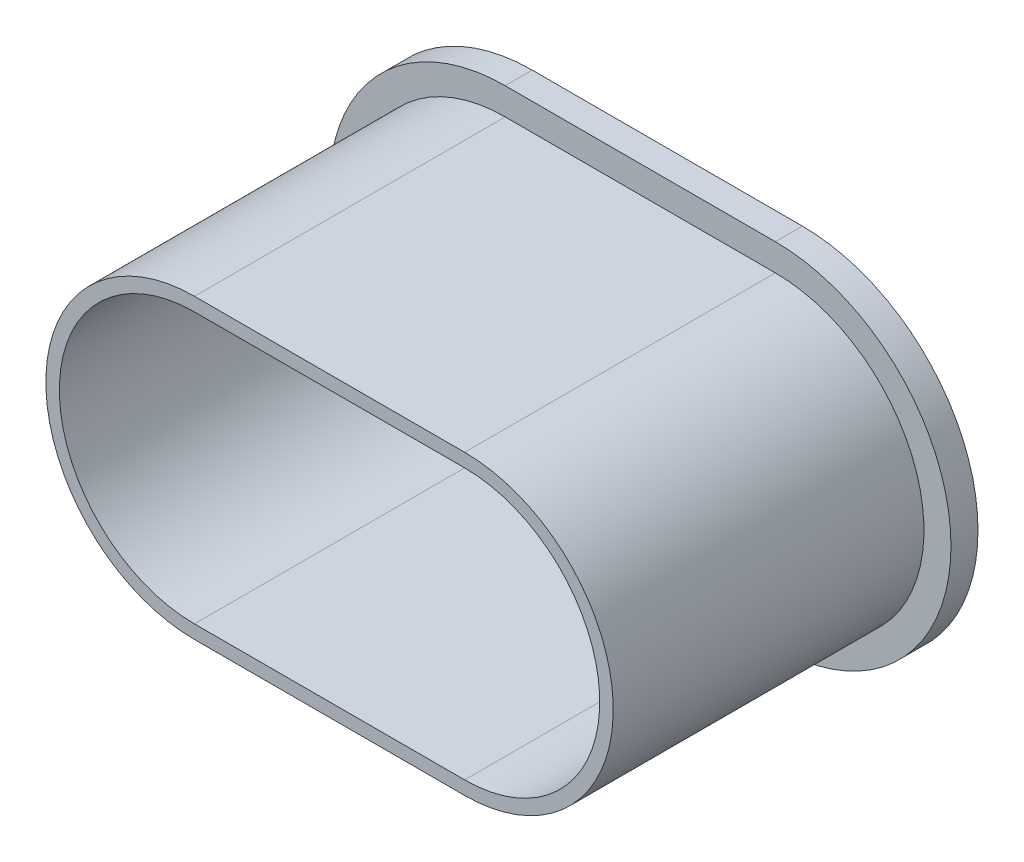
ISO-10303-21;
HEADER;
FILE_DESCRIPTION(('STEP AP214'),'2;1');
FILE_NAME('part.step','',(''),(''),'','','');
FILE_SCHEMA(('AUTOMOTIVE_DESIGN { 1 0 10303 214 1 1 1 1 }'));
ENDSEC;
DATA;
#1=APPLICATION_CONTEXT('core data for automotive mechanical design processes');
#2=APPLICATION_PROTOCOL_DEFINITION('international standard','automotive_design',2000,#1);
#3=PRODUCT_CONTEXT('',#1,'mechanical');
#4=PRODUCT('Part','Part','',(#3));
#5=PRODUCT_RELATED_PRODUCT_CATEGORY('part','',(#4));
#6=PRODUCT_DEFINITION_FORMATION('','',#4);
#7=PRODUCT_DEFINITION_CONTEXT('part definition',#1,'design');
#8=PRODUCT_DEFINITION('design','',#6,#7);
#9=PRODUCT_DEFINITION_SHAPE('','',#8);
#10=(LENGTH_UNIT() NAMED_UNIT(*) SI_UNIT(.MILLI.,.METRE.));
#11=(NAMED_UNIT(*) PLANE_ANGLE_UNIT() SI_UNIT($,.RADIAN.));
#12=(NAMED_UNIT(*) SI_UNIT($,.STERADIAN.) SOLID_ANGLE_UNIT());
#13=UNCERTAINTY_MEASURE_WITH_UNIT(LENGTH_MEASURE(1.E-05),#10,'distance_accuracy_value','');
#14=(GEOMETRIC_REPRESENTATION_CONTEXT(3) GLOBAL_UNCERTAINTY_ASSIGNED_CONTEXT((#13)) GLOBAL_UNIT_ASSIGNED_CONTEXT((#10,
#11,#12)) REPRESENTATION_CONTEXT('',''));
#15=CARTESIAN_POINT('',(0.,0.,0.));
#16=DIRECTION('',(0.,0.,1.));
#17=DIRECTION('',(1.,0.,0.));
#18=AXIS2_PLACEMENT_3D('',#15,#16,#17);
#19=CARTESIAN_POINT('',(-7.16804413634069,-3.46164349097961,2.));
#20=DIRECTION('',(0.,0.,-1.));
#21=DIRECTION('',(-1.,0.,0.));
#22=AXIS2_PLACEMENT_3D('',#19,#20,#21);
#23=PLANE('',#22);
#24=CARTESIAN_POINT('',(-7.16804413634069,-3.46164349097961,2.));
#25=DIRECTION('',(0.,0.,1.));
#26=DIRECTION('',(-1.,0.,0.));
#27=AXIS2_PLACEMENT_3D('',#24,#25,#26);
#28=CIRCLE('',#27,13.);
#29=CARTESIAN_POINT('',(-7.16804413634069,-16.4616434909796,2.));
#30=VERTEX_POINT('',#29);
#31=CARTESIAN_POINT('',(-7.16804413634069,9.53835650902039,2.));
#32=VERTEX_POINT('',#31);
#33=EDGE_CURVE('E193',#30,#32,#28,.T.);
#34=ORIENTED_EDGE('',*,*,#33,.T.);
#35=DIRECTION('',(-1.,0.,0.));
#36=VECTOR('',#35,1.);
#37=CARTESIAN_POINT('',(-27.1680441363407,9.53835650902039,2.));
#38=LINE('',#37,#36);
#39=CARTESIAN_POINT('',(-27.1680441363407,9.53835650902039,2.));
#40=VERTEX_POINT('',#39);
#41=EDGE_CURVE('E196',#32,#40,#38,.T.);
#42=ORIENTED_EDGE('',*,*,#41,.T.);
#43=CARTESIAN_POINT('',(-27.1680441363407,-3.46164349097961,2.));
#44=DIRECTION('',(0.,0.,1.));
#45=DIRECTION('',(-1.,0.,0.));
#46=AXIS2_PLACEMENT_3D('',#43,#44,#45);
#47=CIRCLE('',#46,13.);
#48=CARTESIAN_POINT('',(-27.1680441363407,-16.4616434909796,2.));
#49=VERTEX_POINT('',#48);
#50=EDGE_CURVE('E199',#40,#49,#47,.T.);
#51=ORIENTED_EDGE('',*,*,#50,.T.);
#52=DIRECTION('',(1.,0.,0.));
#53=VECTOR('',#52,1.);
#54=CARTESIAN_POINT('',(-7.16804413634069,-16.4616434909796,2.));
#55=LINE('',#54,#53);
#56=EDGE_CURVE('E201',#49,#30,#55,.T.);
#57=ORIENTED_EDGE('',*,*,#56,.T.);
#58=EDGE_LOOP('',(#34,#42,#51,#57));
#59=FACE_BOUND('',#58,.T.);
#60=CARTESIAN_POINT('',(-7.16804413634065,-3.46164349097961,2.));
#61=DIRECTION('',(0.,0.,1.));
#62=DIRECTION('',(-1.,0.,0.));
#63=AXIS2_PLACEMENT_3D('',#60,#61,#62);
#64=CIRCLE('',#63,11.);
#65=CARTESIAN_POINT('',(-7.16804413634058,-14.4616434909796,2.));
#66=VERTEX_POINT('',#65);
#67=CARTESIAN_POINT('',(-7.16804413634072,7.53835650902039,2.));
#68=VERTEX_POINT('',#67);
#69=EDGE_CURVE('E152',#66,#68,#64,.T.);
#70=ORIENTED_EDGE('',*,*,#69,.F.);
#71=DIRECTION('',(1.,0.,0.));
#72=VECTOR('',#71,1.);
#73=CARTESIAN_POINT('',(-27.1680441363407,-14.4616434909796,2.));
#74=LINE('',#73,#72);
#75=CARTESIAN_POINT('',(-27.1680441363407,-14.4616434909796,2.));
#76=VERTEX_POINT('',#75);
#77=EDGE_CURVE('E157',#76,#66,#74,.T.);
#78=ORIENTED_EDGE('',*,*,#77,.F.);
#79=CARTESIAN_POINT('',(-27.1680441363407,-3.46164349097961,2.));
#80=DIRECTION('',(0.,0.,1.));
#81=DIRECTION('',(-1.,0.,0.));
#82=AXIS2_PLACEMENT_3D('',#79,#80,#81);
#83=CIRCLE('',#82,11.);
#84=CARTESIAN_POINT('',(-27.1680441363407,7.53835650902039,2.));
#85=VERTEX_POINT('',#84);
#86=EDGE_CURVE('E53',#85,#76,#83,.T.);
#87=ORIENTED_EDGE('',*,*,#86,.F.);
#88=DIRECTION('',(-1.,0.,0.));
#89=VECTOR('',#88,1.);
#90=CARTESIAN_POINT('',(-27.1680441363407,7.53835650902039,2.));
#91=LINE('',#90,#89);
#92=EDGE_CURVE('E48',#68,#85,#91,.T.);
#93=ORIENTED_EDGE('',*,*,#92,.F.);
#94=EDGE_LOOP('',(#70,#78,#87,#93));
#95=FACE_BOUND('',#94,.T.);
#96=ADVANCED_FACE('F33',(#59,#95),#23,.F.);
#97=CARTESIAN_POINT('',(-7.16804413634069,-3.46164349097961,0.));
#98=DIRECTION('',(0.,0.,-1.));
#99=DIRECTION('',(-1.,0.,0.));
#100=AXIS2_PLACEMENT_3D('',#97,#98,#99);
#101=PLANE('',#100);
#102=CARTESIAN_POINT('',(-17.1680441363407,-14.4616434909796,0.));
#103=DIRECTION('',(0.,0.,-1.));
#104=DIRECTION('',(-1.,0.,0.));
#105=AXIS2_PLACEMENT_3D('',#102,#103,#104);
#106=CIRCLE('',#105,0.3);
#107=CARTESIAN_POINT('',(-17.4680441363407,-14.4616434909796,0.));
#108=VERTEX_POINT('',#107);
#109=EDGE_CURVE('E301',#108,#108,#106,.T.);
#110=ORIENTED_EDGE('',*,*,#109,.F.);
#111=EDGE_LOOP('',(#110));
#112=FACE_BOUND('',#111,.T.);
#113=CARTESIAN_POINT('',(-7.16804413634069,-3.46164349097961,0.));
#114=DIRECTION('',(0.,0.,1.));
#115=DIRECTION('',(-1.,0.,0.));
#116=AXIS2_PLACEMENT_3D('',#113,#114,#115);
#117=CIRCLE('',#116,13.);
#118=CARTESIAN_POINT('',(-7.16804413634069,-16.4616434909796,0.));
#119=VERTEX_POINT('',#118);
#120=CARTESIAN_POINT('',(-7.16804413634069,9.53835650902039,0.));
#121=VERTEX_POINT('',#120);
#122=EDGE_CURVE('E130',#119,#121,#117,.T.);
#123=ORIENTED_EDGE('',*,*,#122,.F.);
#124=DIRECTION('',(1.,0.,0.));
#125=VECTOR('',#124,1.);
#126=CARTESIAN_POINT('',(-7.16804413634069,-16.4616434909796,0.));
#127=LINE('',#126,#125);
#128=CARTESIAN_POINT('',(-27.1680441363407,-16.4616434909796,0.));
#129=VERTEX_POINT('',#128);
#130=EDGE_CURVE('E197',#129,#119,#127,.T.);
#131=ORIENTED_EDGE('',*,*,#130,.F.);
#132=CARTESIAN_POINT('',(-27.1680441363407,-3.46164349097961,0.));
#133=DIRECTION('',(0.,0.,1.));
#134=DIRECTION('',(-1.,0.,0.));
#135=AXIS2_PLACEMENT_3D('',#132,#133,#134);
#136=CIRCLE('',#135,13.);
#137=CARTESIAN_POINT('',(-27.1680441363407,9.53835650902039,0.));
#138=VERTEX_POINT('',#137);
#139=EDGE_CURVE('E208',#138,#129,#136,.T.);
#140=ORIENTED_EDGE('',*,*,#139,.F.);
#141=DIRECTION('',(-1.,0.,0.));
#142=VECTOR('',#141,1.);
#143=CARTESIAN_POINT('',(-27.1680441363407,9.53835650902039,0.));
#144=LINE('',#143,#142);
#145=EDGE_CURVE('E206',#121,#138,#144,.T.);
#146=ORIENTED_EDGE('',*,*,#145,.F.);
#147=EDGE_LOOP('',(#123,#131,#140,#146));
#148=FACE_BOUND('',#147,.T.);
#149=DIRECTION('',(-1.,0.,0.));
#150=VECTOR('',#149,1.);
#151=CARTESIAN_POINT('',(-27.1680441363407,6.53835650902039,0.));
#152=LINE('',#151,#150);
#153=CARTESIAN_POINT('',(-7.16804413634069,6.53835650902039,0.));
#154=VERTEX_POINT('',#153);
#155=CARTESIAN_POINT('',(-27.1680441363407,6.53835650902039,0.));
#156=VERTEX_POINT('',#155);
#157=EDGE_CURVE('E186',#154,#156,#152,.T.);
#158=ORIENTED_EDGE('',*,*,#157,.T.);
#159=CARTESIAN_POINT('',(-27.1680441363407,-3.46164349097961,0.));
#160=DIRECTION('',(0.,0.,1.));
#161=DIRECTION('',(-1.,0.,0.));
#162=AXIS2_PLACEMENT_3D('',#159,#160,#161);
#163=CIRCLE('',#162,10.);
#164=CARTESIAN_POINT('',(-27.1680441363407,-13.4616434909796,0.));
#165=VERTEX_POINT('',#164);
#166=EDGE_CURVE('E180',#156,#165,#163,.T.);
#167=ORIENTED_EDGE('',*,*,#166,.T.);
#168=DIRECTION('',(1.,0.,0.));
#169=VECTOR('',#168,1.);
#170=CARTESIAN_POINT('',(-27.1680441363407,-13.4616434909796,0.));
#171=LINE('',#170,#169);
#172=CARTESIAN_POINT('',(-7.16804413634069,-13.4616434909796,0.));
#173=VERTEX_POINT('',#172);
#174=EDGE_CURVE('E127',#165,#173,#171,.T.);
#175=ORIENTED_EDGE('',*,*,#174,.T.);
#176=CARTESIAN_POINT('',(-7.16804413634069,-3.46164349097961,0.));
#177=DIRECTION('',(0.,0.,1.));
#178=DIRECTION('',(-1.,0.,0.));
#179=AXIS2_PLACEMENT_3D('',#176,#177,#178);
#180=CIRCLE('',#179,10.);
#181=EDGE_CURVE('E183',#173,#154,#180,.T.);
#182=ORIENTED_EDGE('',*,*,#181,.T.);
#183=EDGE_LOOP('',(#158,#167,#175,#182));
#184=FACE_BOUND('',#183,.T.);
#185=ADVANCED_FACE('F226',(#112,#148,#184),#101,.T.);
#186=CARTESIAN_POINT('',(-7.16804413634069,-3.46164349097961,2.));
#187=DIRECTION('',(0.,0.,-1.));
#188=DIRECTION('',(-1.,0.,0.));
#189=AXIS2_PLACEMENT_3D('',#186,#187,#188);
#190=CYLINDRICAL_SURFACE('',#189,13.);
#191=ORIENTED_EDGE('',*,*,#122,.T.);
#192=DIRECTION('',(0.,0.,-1.));
#193=VECTOR('',#192,1.);
#194=CARTESIAN_POINT('',(-7.16804413634069,9.53835650902039,2.));
#195=LINE('',#194,#193);
#196=EDGE_CURVE('E11',#32,#121,#195,.T.);
#197=ORIENTED_EDGE('',*,*,#196,.F.);
#198=ORIENTED_EDGE('',*,*,#33,.F.);
#199=DIRECTION('',(0.,0.,-1.));
#200=VECTOR('',#199,1.);
#201=CARTESIAN_POINT('',(-7.16804413634069,-16.4616434909796,2.));
#202=LINE('',#201,#200);
#203=EDGE_CURVE('E203',#30,#119,#202,.T.);
#204=ORIENTED_EDGE('',*,*,#203,.T.);
#205=EDGE_LOOP('',(#191,#197,#198,#204));
#206=FACE_BOUND('',#205,.T.);
#207=ADVANCED_FACE('F35',(#206),#190,.T.);
#208=CARTESIAN_POINT('',(-27.1680441363407,9.53835650902039,2.));
#209=DIRECTION('',(0.,-1.,0.));
#210=DIRECTION('',(0.,0.,-1.));
#211=AXIS2_PLACEMENT_3D('',#208,#209,#210);
#212=PLANE('',#211);
#213=ORIENTED_EDGE('',*,*,#145,.T.);
#214=DIRECTION('',(0.,0.,-1.));
#215=VECTOR('',#214,1.);
#216=CARTESIAN_POINT('',(-27.1680441363407,9.53835650902039,2.));
#217=LINE('',#216,#215);
#218=EDGE_CURVE('E41',#40,#138,#217,.T.);
#219=ORIENTED_EDGE('',*,*,#218,.F.);
#220=ORIENTED_EDGE('',*,*,#41,.F.);
#221=ORIENTED_EDGE('',*,*,#196,.T.);
#222=EDGE_LOOP('',(#213,#219,#220,#221));
#223=FACE_BOUND('',#222,.T.);
#224=ADVANCED_FACE('F236',(#223),#212,.F.);
#225=CARTESIAN_POINT('',(-27.1680441363407,-3.46164349097961,2.));
#226=DIRECTION('',(0.,0.,-1.));
#227=DIRECTION('',(-1.,0.,0.));
#228=AXIS2_PLACEMENT_3D('',#225,#226,#227);
#229=CYLINDRICAL_SURFACE('',#228,13.);
#230=ORIENTED_EDGE('',*,*,#139,.T.);
#231=DIRECTION('',(0.,0.,-1.));
#232=VECTOR('',#231,1.);
#233=CARTESIAN_POINT('',(-27.1680441363407,-16.4616434909796,2.));
#234=LINE('',#233,#232);
#235=EDGE_CURVE('E213',#49,#129,#234,.T.);
#236=ORIENTED_EDGE('',*,*,#235,.F.);
#237=ORIENTED_EDGE('',*,*,#50,.F.);
#238=ORIENTED_EDGE('',*,*,#218,.T.);
#239=EDGE_LOOP('',(#230,#236,#237,#238));
#240=FACE_BOUND('',#239,.T.);
#241=ADVANCED_FACE('F220',(#240),#229,.T.);
#242=CARTESIAN_POINT('',(-7.16804413634069,-16.4616434909796,2.));
#243=DIRECTION('',(0.,1.,0.));
#244=DIRECTION('',(0.,0.,1.));
#245=AXIS2_PLACEMENT_3D('',#242,#243,#244);
#246=PLANE('',#245);
#247=ORIENTED_EDGE('',*,*,#130,.T.);
#248=ORIENTED_EDGE('',*,*,#203,.F.);
#249=ORIENTED_EDGE('',*,*,#56,.F.);
#250=ORIENTED_EDGE('',*,*,#235,.T.);
#251=EDGE_LOOP('',(#247,#248,#249,#250));
#252=FACE_BOUND('',#251,.T.);
#253=ADVANCED_FACE('F230',(#252),#246,.F.);
#254=CARTESIAN_POINT('',(-27.1680441363407,-3.46164349097961,2.));
#255=DIRECTION('',(0.,0.,-1.));
#256=DIRECTION('',(-1.,0.,0.));
#257=AXIS2_PLACEMENT_3D('',#254,#255,#256);
#258=CYLINDRICAL_SURFACE('',#257,10.);
#259=ORIENTED_EDGE('',*,*,#166,.F.);
#260=DIRECTION('',(0.,0.,-1.));
#261=VECTOR('',#260,1.);
#262=CARTESIAN_POINT('',(-27.1680441363407,6.53835650902039,2.));
#263=LINE('',#262,#261);
#264=CARTESIAN_POINT('',(-27.1680441363407,6.53835650902039,25.));
#265=VERTEX_POINT('',#264);
#266=EDGE_CURVE('E137',#265,#156,#263,.T.);
#267=ORIENTED_EDGE('',*,*,#266,.F.);
#268=CARTESIAN_POINT('',(-27.1680441363407,-3.46164349097961,25.));
#269=DIRECTION('',(0.,0.,1.));
#270=DIRECTION('',(1.,0.,0.));
#271=AXIS2_PLACEMENT_3D('',#268,#269,#270);
#272=CIRCLE('',#271,10.);
#273=CARTESIAN_POINT('',(-27.1680441363407,-13.4616434909796,25.));
#274=VERTEX_POINT('',#273);
#275=EDGE_CURVE('E134',#265,#274,#272,.T.);
#276=ORIENTED_EDGE('',*,*,#275,.T.);
#277=DIRECTION('',(0.,0.,-1.));
#278=VECTOR('',#277,1.);
#279=CARTESIAN_POINT('',(-27.1680441363407,-13.4616434909796,2.));
#280=LINE('',#279,#278);
#281=EDGE_CURVE('E120',#274,#165,#280,.T.);
#282=ORIENTED_EDGE('',*,*,#281,.T.);
#283=EDGE_LOOP('',(#259,#267,#276,#282));
#284=FACE_BOUND('',#283,.T.);
#285=ADVANCED_FACE('F135',(#284),#258,.F.);
#286=CARTESIAN_POINT('',(-27.1680441363407,-13.4616434909796,2.));
#287=DIRECTION('',(0.,1.,0.));
#288=DIRECTION('',(0.,0.,1.));
#289=AXIS2_PLACEMENT_3D('',#286,#287,#288);
#290=PLANE('',#289);
#291=ORIENTED_EDGE('',*,*,#174,.F.);
#292=ORIENTED_EDGE('',*,*,#281,.F.);
#293=DIRECTION('',(1.,0.,0.));
#294=VECTOR('',#293,1.);
#295=CARTESIAN_POINT('',(-7.16804413634058,-13.4616434909796,25.));
#296=LINE('',#295,#294);
#297=CARTESIAN_POINT('',(-7.16804413634058,-13.4616434909796,25.));
#298=VERTEX_POINT('',#297);
#299=EDGE_CURVE('E124',#274,#298,#296,.T.);
#300=ORIENTED_EDGE('',*,*,#299,.T.);
#301=DIRECTION('',(0.,0.,-1.));
#302=VECTOR('',#301,1.);
#303=CARTESIAN_POINT('',(-7.16804413634069,-13.4616434909796,2.));
#304=LINE('',#303,#302);
#305=EDGE_CURVE('E131',#298,#173,#304,.T.);
#306=ORIENTED_EDGE('',*,*,#305,.T.);
#307=EDGE_LOOP('',(#291,#292,#300,#306));
#308=FACE_BOUND('',#307,.T.);
#309=ADVANCED_FACE('F122',(#308),#290,.T.);
#310=CARTESIAN_POINT('',(-7.16804413634069,-3.46164349097961,2.));
#311=DIRECTION('',(0.,0.,-1.));
#312=DIRECTION('',(-1.,0.,0.));
#313=AXIS2_PLACEMENT_3D('',#310,#311,#312);
#314=CYLINDRICAL_SURFACE('',#313,10.);
#315=ORIENTED_EDGE('',*,*,#181,.F.);
#316=ORIENTED_EDGE('',*,*,#305,.F.);
#317=CARTESIAN_POINT('',(-7.16804413634065,-3.46164349097961,25.));
#318=DIRECTION('',(0.,0.,1.));
#319=DIRECTION('',(-1.,0.,0.));
#320=AXIS2_PLACEMENT_3D('',#317,#318,#319);
#321=CIRCLE('',#320,10.);
#322=CARTESIAN_POINT('',(-7.16804413634072,6.53835650902039,25.));
#323=VERTEX_POINT('',#322);
#324=EDGE_CURVE('E145',#298,#323,#321,.T.);
#325=ORIENTED_EDGE('',*,*,#324,.T.);
#326=DIRECTION('',(0.,0.,-1.));
#327=VECTOR('',#326,1.);
#328=CARTESIAN_POINT('',(-7.16804413634069,6.53835650902039,2.));
#329=LINE('',#328,#327);
#330=EDGE_CURVE('E190',#323,#154,#329,.T.);
#331=ORIENTED_EDGE('',*,*,#330,.T.);
#332=EDGE_LOOP('',(#315,#316,#325,#331));
#333=FACE_BOUND('',#332,.T.);
#334=ADVANCED_FACE('F260',(#333),#314,.F.);
#335=CARTESIAN_POINT('',(-27.1680441363407,6.53835650902039,2.));
#336=DIRECTION('',(0.,-1.,0.));
#337=DIRECTION('',(0.,0.,-1.));
#338=AXIS2_PLACEMENT_3D('',#335,#336,#337);
#339=PLANE('',#338);
#340=ORIENTED_EDGE('',*,*,#157,.F.);
#341=ORIENTED_EDGE('',*,*,#330,.F.);
#342=DIRECTION('',(-1.,0.,0.));
#343=VECTOR('',#342,1.);
#344=CARTESIAN_POINT('',(-27.1680441363407,6.53835650902039,25.));
#345=LINE('',#344,#343);
#346=EDGE_CURVE('E147',#323,#265,#345,.T.);
#347=ORIENTED_EDGE('',*,*,#346,.T.);
#348=ORIENTED_EDGE('',*,*,#266,.T.);
#349=EDGE_LOOP('',(#340,#341,#347,#348));
#350=FACE_BOUND('',#349,.T.);
#351=ADVANCED_FACE('F264',(#350),#339,.T.);
#352=CARTESIAN_POINT('',(-7.16804413634065,-3.46164349097961,25.));
#353=DIRECTION('',(0.,0.,-1.));
#354=DIRECTION('',(-1.,0.,0.));
#355=AXIS2_PLACEMENT_3D('',#352,#353,#354);
#356=PLANE('',#355);
#357=CARTESIAN_POINT('',(-7.16804413634065,-3.46164349097961,25.));
#358=DIRECTION('',(0.,0.,1.));
#359=DIRECTION('',(-1.,0.,0.));
#360=AXIS2_PLACEMENT_3D('',#357,#358,#359);
#361=CIRCLE('',#360,11.);
#362=CARTESIAN_POINT('',(-7.16804413634058,-14.4616434909796,25.));
#363=VERTEX_POINT('',#362);
#364=CARTESIAN_POINT('',(-7.16804413634072,7.53835650902039,25.));
#365=VERTEX_POINT('',#364);
#366=EDGE_CURVE('E153',#363,#365,#361,.T.);
#367=ORIENTED_EDGE('',*,*,#366,.T.);
#368=DIRECTION('',(-1.,0.,0.));
#369=VECTOR('',#368,1.);
#370=CARTESIAN_POINT('',(-27.1680441363407,7.53835650902039,25.));
#371=LINE('',#370,#369);
#372=CARTESIAN_POINT('',(-27.1680441363407,7.53835650902039,25.));
#373=VERTEX_POINT('',#372);
#374=EDGE_CURVE('E156',#365,#373,#371,.T.);
#375=ORIENTED_EDGE('',*,*,#374,.T.);
#376=CARTESIAN_POINT('',(-27.1680441363407,-3.46164349097961,25.));
#377=DIRECTION('',(0.,0.,1.));
#378=DIRECTION('',(-1.,0.,0.));
#379=AXIS2_PLACEMENT_3D('',#376,#377,#378);
#380=CIRCLE('',#379,11.);
#381=CARTESIAN_POINT('',(-27.1680441363407,-14.4616434909796,25.));
#382=VERTEX_POINT('',#381);
#383=EDGE_CURVE('E159',#373,#382,#380,.T.);
#384=ORIENTED_EDGE('',*,*,#383,.T.);
#385=DIRECTION('',(1.,0.,0.));
#386=VECTOR('',#385,1.);
#387=CARTESIAN_POINT('',(-27.1680441363407,-14.4616434909796,25.));
#388=LINE('',#387,#386);
#389=EDGE_CURVE('E161',#382,#363,#388,.T.);
#390=ORIENTED_EDGE('',*,*,#389,.T.);
#391=EDGE_LOOP('',(#367,#375,#384,#390));
#392=FACE_BOUND('',#391,.T.);
#393=ORIENTED_EDGE('',*,*,#275,.F.);
#394=ORIENTED_EDGE('',*,*,#346,.F.);
#395=ORIENTED_EDGE('',*,*,#324,.F.);
#396=ORIENTED_EDGE('',*,*,#299,.F.);
#397=EDGE_LOOP('',(#393,#394,#395,#396));
#398=FACE_BOUND('',#397,.T.);
#399=ADVANCED_FACE('F143',(#392,#398),#356,.F.);
#400=CARTESIAN_POINT('',(-7.16804413634065,-3.46164349097961,25.));
#401=DIRECTION('',(0.,0.,-1.));
#402=DIRECTION('',(-1.,0.,0.));
#403=AXIS2_PLACEMENT_3D('',#400,#401,#402);
#404=CYLINDRICAL_SURFACE('',#403,11.);
#405=ORIENTED_EDGE('',*,*,#69,.T.);
#406=DIRECTION('',(0.,0.,-1.));
#407=VECTOR('',#406,1.);
#408=CARTESIAN_POINT('',(-7.16804413634072,7.53835650902039,25.));
#409=LINE('',#408,#407);
#410=EDGE_CURVE('E178',#365,#68,#409,.T.);
#411=ORIENTED_EDGE('',*,*,#410,.F.);
#412=ORIENTED_EDGE('',*,*,#366,.F.);
#413=DIRECTION('',(0.,0.,-1.));
#414=VECTOR('',#413,1.);
#415=CARTESIAN_POINT('',(-7.16804413634058,-14.4616434909796,25.));
#416=LINE('',#415,#414);
#417=EDGE_CURVE('E163',#363,#66,#416,.T.);
#418=ORIENTED_EDGE('',*,*,#417,.T.);
#419=EDGE_LOOP('',(#405,#411,#412,#418));
#420=FACE_BOUND('',#419,.T.);
#421=ADVANCED_FACE('F271',(#420),#404,.T.);
#422=CARTESIAN_POINT('',(-27.1680441363407,7.53835650902039,25.));
#423=DIRECTION('',(0.,-1.,0.));
#424=DIRECTION('',(0.,0.,-1.));
#425=AXIS2_PLACEMENT_3D('',#422,#423,#424);
#426=PLANE('',#425);
#427=ORIENTED_EDGE('',*,*,#92,.T.);
#428=DIRECTION('',(0.,0.,-1.));
#429=VECTOR('',#428,1.);
#430=CARTESIAN_POINT('',(-27.1680441363407,7.53835650902039,25.));
#431=LINE('',#430,#429);
#432=EDGE_CURVE('E175',#373,#85,#431,.T.);
#433=ORIENTED_EDGE('',*,*,#432,.F.);
#434=ORIENTED_EDGE('',*,*,#374,.F.);
#435=ORIENTED_EDGE('',*,*,#410,.T.);
#436=EDGE_LOOP('',(#427,#433,#434,#435));
#437=FACE_BOUND('',#436,.T.);
#438=ADVANCED_FACE('F274',(#437),#426,.F.);
#439=CARTESIAN_POINT('',(-27.1680441363407,-3.46164349097961,25.));
#440=DIRECTION('',(0.,0.,-1.));
#441=DIRECTION('',(-1.,0.,0.));
#442=AXIS2_PLACEMENT_3D('',#439,#440,#441);
#443=CYLINDRICAL_SURFACE('',#442,11.);
#444=ORIENTED_EDGE('',*,*,#86,.T.);
#445=DIRECTION('',(0.,0.,-1.));
#446=VECTOR('',#445,1.);
#447=CARTESIAN_POINT('',(-27.1680441363407,-14.4616434909796,25.));
#448=LINE('',#447,#446);
#449=EDGE_CURVE('E172',#382,#76,#448,.T.);
#450=ORIENTED_EDGE('',*,*,#449,.F.);
#451=ORIENTED_EDGE('',*,*,#383,.F.);
#452=ORIENTED_EDGE('',*,*,#432,.T.);
#453=EDGE_LOOP('',(#444,#450,#451,#452));
#454=FACE_BOUND('',#453,.T.);
#455=ADVANCED_FACE('F278',(#454),#443,.T.);
#456=CARTESIAN_POINT('',(-27.1680441363407,-14.4616434909796,25.));
#457=DIRECTION('',(0.,1.,0.));
#458=DIRECTION('',(0.,0.,1.));
#459=AXIS2_PLACEMENT_3D('',#456,#457,#458);
#460=PLANE('',#459);
#461=ORIENTED_EDGE('',*,*,#77,.T.);
#462=ORIENTED_EDGE('',*,*,#417,.F.);
#463=ORIENTED_EDGE('',*,*,#389,.F.);
#464=ORIENTED_EDGE('',*,*,#449,.T.);
#465=EDGE_LOOP('',(#461,#462,#463,#464));
#466=FACE_BOUND('',#465,.T.);
#467=ADVANCED_FACE('F282',(#466),#460,.F.);
#468=CARTESIAN_POINT('',(-17.1680441363407,-14.4616434909796,0.5));
#469=DIRECTION('',(0.,0.,-1.));
#470=DIRECTION('',(-1.,0.,0.));
#471=AXIS2_PLACEMENT_3D('',#468,#469,#470);
#472=CYLINDRICAL_SURFACE('',#471,0.3);
#473=CARTESIAN_POINT('',(-17.1680441363407,-14.4616434909796,0.5));
#474=DIRECTION('',(0.,0.,-1.));
#475=DIRECTION('',(-1.,0.,0.));
#476=AXIS2_PLACEMENT_3D('',#473,#474,#475);
#477=CIRCLE('',#476,0.3);
#478=CARTESIAN_POINT('',(-17.4680441363407,-14.4616434909796,0.5));
#479=VERTEX_POINT('',#478);
#480=EDGE_CURVE('E141',#479,#479,#477,.T.);
#481=ORIENTED_EDGE('',*,*,#480,.F.);
#482=EDGE_LOOP('',(#481));
#483=FACE_BOUND('',#482,.T.);
#484=ORIENTED_EDGE('',*,*,#109,.T.);
#485=EDGE_LOOP('',(#484));
#486=FACE_BOUND('',#485,.T.);
#487=ADVANCED_FACE('F286',(#483,#486),#472,.F.);
#488=CARTESIAN_POINT('',(0.,0.,0.5));
#489=DIRECTION('',(0.,0.,-1.));
#490=DIRECTION('',(-1.,0.,0.));
#491=AXIS2_PLACEMENT_3D('',#488,#489,#490);
#492=PLANE('',#491);
#493=ORIENTED_EDGE('',*,*,#480,.T.);
#494=EDGE_LOOP('',(#493));
#495=FACE_BOUND('',#494,.T.);
#496=ADVANCED_FACE('F293',(#495),#492,.T.);
#497=CLOSED_SHELL('',(#96,#185,#207,#224,#241,#253,#285,#309,#334,#351,#399,#421,#438,#455,#467,
#487,#496));
#498=MANIFOLD_SOLID_BREP('B2',#497);
#499=ADVANCED_BREP_SHAPE_REPRESENTATION('',(#18,#498),#14);
#500=SHAPE_DEFINITION_REPRESENTATION(#9,#499);
ENDSEC;
END-ISO-10303-21;
